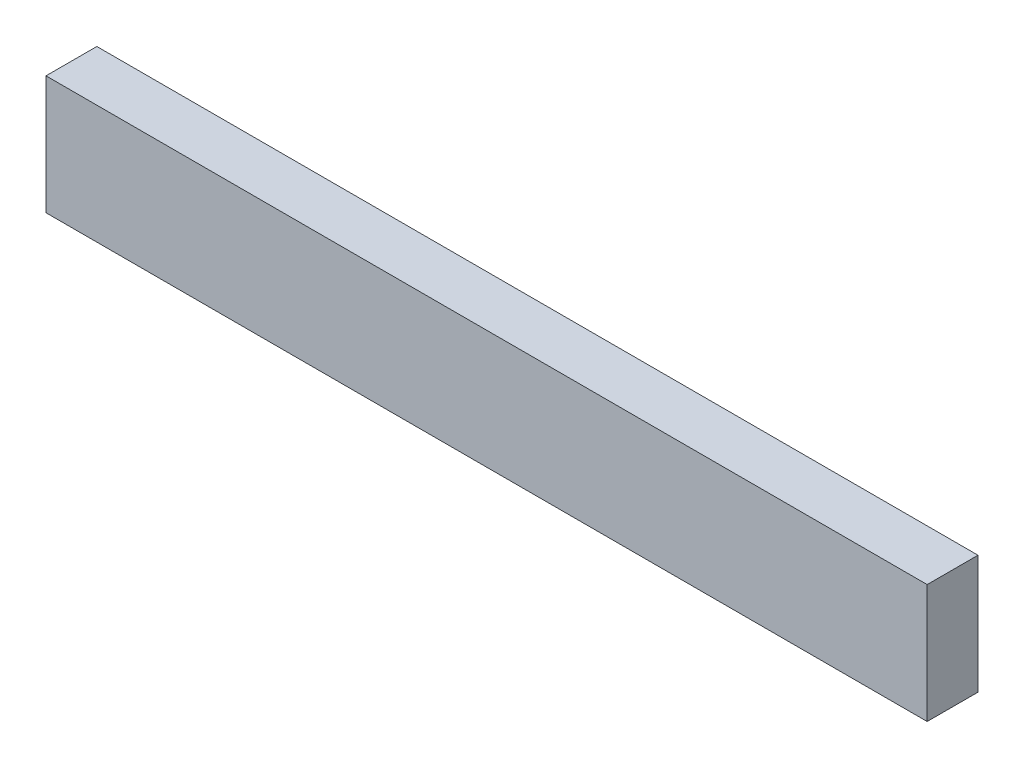
ISO-10303-21;
HEADER;
FILE_DESCRIPTION(('STEP AP214'),'2;1');
FILE_NAME('part.step','',(''),(''),'','','');
FILE_SCHEMA(('AUTOMOTIVE_DESIGN { 1 0 10303 214 1 1 1 1 }'));
ENDSEC;
DATA;
#1=APPLICATION_CONTEXT('core data for automotive mechanical design processes');
#2=APPLICATION_PROTOCOL_DEFINITION('international standard','automotive_design',2000,#1);
#3=PRODUCT_CONTEXT('',#1,'mechanical');
#4=PRODUCT('Part','Part','',(#3));
#5=PRODUCT_RELATED_PRODUCT_CATEGORY('part','',(#4));
#6=PRODUCT_DEFINITION_FORMATION('','',#4);
#7=PRODUCT_DEFINITION_CONTEXT('part definition',#1,'design');
#8=PRODUCT_DEFINITION('design','',#6,#7);
#9=PRODUCT_DEFINITION_SHAPE('','',#8);
#10=(LENGTH_UNIT() NAMED_UNIT(*) SI_UNIT(.MILLI.,.METRE.));
#11=(NAMED_UNIT(*) PLANE_ANGLE_UNIT() SI_UNIT($,.RADIAN.));
#12=(NAMED_UNIT(*) SI_UNIT($,.STERADIAN.) SOLID_ANGLE_UNIT());
#13=UNCERTAINTY_MEASURE_WITH_UNIT(LENGTH_MEASURE(1.E-05),#10,'distance_accuracy_value','');
#14=(GEOMETRIC_REPRESENTATION_CONTEXT(3) GLOBAL_UNCERTAINTY_ASSIGNED_CONTEXT((#13)) GLOBAL_UNIT_ASSIGNED_CONTEXT((#10,
#11,#12)) REPRESENTATION_CONTEXT('',''));
#15=CARTESIAN_POINT('',(0.,0.,0.));
#16=DIRECTION('',(0.,0.,1.));
#17=DIRECTION('',(1.,0.,0.));
#18=AXIS2_PLACEMENT_3D('',#15,#16,#17);
#19=CARTESIAN_POINT('',(660.4,-44.45,-19.05));
#20=DIRECTION('',(0.,0.,1.));
#21=DIRECTION('',(1.,0.,0.));
#22=AXIS2_PLACEMENT_3D('',#19,#20,#21);
#23=PLANE('',#22);
#24=DIRECTION('',(0.,1.,0.));
#25=VECTOR('',#24,1.);
#26=CARTESIAN_POINT('',(0.,-44.45,-19.05));
#27=LINE('',#26,#25);
#28=CARTESIAN_POINT('',(0.,-44.45,-19.05));
#29=VERTEX_POINT('',#28);
#30=CARTESIAN_POINT('',(0.,44.45,-19.05));
#31=VERTEX_POINT('',#30);
#32=EDGE_CURVE('E95',#29,#31,#27,.T.);
#33=ORIENTED_EDGE('',*,*,#32,.T.);
#34=DIRECTION('',(-1.,0.,0.));
#35=VECTOR('',#34,1.);
#36=CARTESIAN_POINT('',(660.4,44.45,-19.05));
#37=LINE('',#36,#35);
#38=CARTESIAN_POINT('',(660.4,44.45,-19.05));
#39=VERTEX_POINT('',#38);
#40=EDGE_CURVE('E11',#39,#31,#37,.T.);
#41=ORIENTED_EDGE('',*,*,#40,.F.);
#42=DIRECTION('',(0.,1.,0.));
#43=VECTOR('',#42,1.);
#44=CARTESIAN_POINT('',(660.4,-44.45,-19.05));
#45=LINE('',#44,#43);
#46=CARTESIAN_POINT('',(660.4,-44.45,-19.05));
#47=VERTEX_POINT('',#46);
#48=EDGE_CURVE('E83',#47,#39,#45,.T.);
#49=ORIENTED_EDGE('',*,*,#48,.F.);
#50=DIRECTION('',(-1.,0.,0.));
#51=VECTOR('',#50,1.);
#52=CARTESIAN_POINT('',(660.4,-44.45,-19.05));
#53=LINE('',#52,#51);
#54=EDGE_CURVE('E91',#47,#29,#53,.T.);
#55=ORIENTED_EDGE('',*,*,#54,.T.);
#56=EDGE_LOOP('',(#33,#41,#49,#55));
#57=FACE_BOUND('',#56,.T.);
#58=ADVANCED_FACE('F32',(#57),#23,.F.);
#59=CARTESIAN_POINT('',(660.4,44.45,19.05));
#60=DIRECTION('',(0.,-1.,0.));
#61=DIRECTION('',(0.,0.,-1.));
#62=AXIS2_PLACEMENT_3D('',#59,#60,#61);
#63=PLANE('',#62);
#64=DIRECTION('',(0.,0.,1.));
#65=VECTOR('',#64,1.);
#66=CARTESIAN_POINT('',(0.,44.45,19.05));
#67=LINE('',#66,#65);
#68=CARTESIAN_POINT('',(0.,44.45,19.05));
#69=VERTEX_POINT('',#68);
#70=EDGE_CURVE('E87',#31,#69,#67,.T.);
#71=ORIENTED_EDGE('',*,*,#70,.T.);
#72=DIRECTION('',(-1.,0.,0.));
#73=VECTOR('',#72,1.);
#74=CARTESIAN_POINT('',(660.4,44.45,19.05));
#75=LINE('',#74,#73);
#76=CARTESIAN_POINT('',(660.4,44.45,19.05));
#77=VERTEX_POINT('',#76);
#78=EDGE_CURVE('E40',#77,#69,#75,.T.);
#79=ORIENTED_EDGE('',*,*,#78,.F.);
#80=DIRECTION('',(0.,0.,1.));
#81=VECTOR('',#80,1.);
#82=CARTESIAN_POINT('',(660.4,44.45,19.05));
#83=LINE('',#82,#81);
#84=EDGE_CURVE('E78',#39,#77,#83,.T.);
#85=ORIENTED_EDGE('',*,*,#84,.F.);
#86=ORIENTED_EDGE('',*,*,#40,.T.);
#87=EDGE_LOOP('',(#71,#79,#85,#86));
#88=FACE_BOUND('',#87,.T.);
#89=ADVANCED_FACE('F86',(#88),#63,.F.);
#90=CARTESIAN_POINT('',(660.4,-44.45,19.05));
#91=DIRECTION('',(0.,0.,-1.));
#92=DIRECTION('',(-1.,0.,0.));
#93=AXIS2_PLACEMENT_3D('',#90,#91,#92);
#94=PLANE('',#93);
#95=DIRECTION('',(0.,-1.,0.));
#96=VECTOR('',#95,1.);
#97=CARTESIAN_POINT('',(0.,-44.45,19.05));
#98=LINE('',#97,#96);
#99=CARTESIAN_POINT('',(0.,-44.45,19.05));
#100=VERTEX_POINT('',#99);
#101=EDGE_CURVE('E65',#69,#100,#98,.T.);
#102=ORIENTED_EDGE('',*,*,#101,.T.);
#103=DIRECTION('',(-1.,0.,0.));
#104=VECTOR('',#103,1.);
#105=CARTESIAN_POINT('',(660.4,-44.45,19.05));
#106=LINE('',#105,#104);
#107=CARTESIAN_POINT('',(660.4,-44.45,19.05));
#108=VERTEX_POINT('',#107);
#109=EDGE_CURVE('E88',#108,#100,#106,.T.);
#110=ORIENTED_EDGE('',*,*,#109,.F.);
#111=DIRECTION('',(0.,-1.,0.));
#112=VECTOR('',#111,1.);
#113=CARTESIAN_POINT('',(660.4,-44.45,19.05));
#114=LINE('',#113,#112);
#115=EDGE_CURVE('E81',#77,#108,#114,.T.);
#116=ORIENTED_EDGE('',*,*,#115,.F.);
#117=ORIENTED_EDGE('',*,*,#78,.T.);
#118=EDGE_LOOP('',(#102,#110,#116,#117));
#119=FACE_BOUND('',#118,.T.);
#120=ADVANCED_FACE('F89',(#119),#94,.F.);
#121=CARTESIAN_POINT('',(660.4,-44.45,19.05));
#122=DIRECTION('',(0.,1.,0.));
#123=DIRECTION('',(0.,0.,1.));
#124=AXIS2_PLACEMENT_3D('',#121,#122,#123);
#125=PLANE('',#124);
#126=DIRECTION('',(0.,0.,-1.));
#127=VECTOR('',#126,1.);
#128=CARTESIAN_POINT('',(0.,-44.45,19.05));
#129=LINE('',#128,#127);
#130=EDGE_CURVE('E71',#100,#29,#129,.T.);
#131=ORIENTED_EDGE('',*,*,#130,.T.);
#132=ORIENTED_EDGE('',*,*,#54,.F.);
#133=DIRECTION('',(0.,0.,-1.));
#134=VECTOR('',#133,1.);
#135=CARTESIAN_POINT('',(660.4,-44.45,19.05));
#136=LINE('',#135,#134);
#137=EDGE_CURVE('E48',#108,#47,#136,.T.);
#138=ORIENTED_EDGE('',*,*,#137,.F.);
#139=ORIENTED_EDGE('',*,*,#109,.T.);
#140=EDGE_LOOP('',(#131,#132,#138,#139));
#141=FACE_BOUND('',#140,.T.);
#142=ADVANCED_FACE('F102',(#141),#125,.F.);
#143=CARTESIAN_POINT('',(660.4,0.,0.));
#144=DIRECTION('',(-1.,0.,0.));
#145=DIRECTION('',(0.,0.,1.));
#146=AXIS2_PLACEMENT_3D('',#143,#144,#145);
#147=PLANE('',#146);
#148=ORIENTED_EDGE('',*,*,#48,.T.);
#149=ORIENTED_EDGE('',*,*,#84,.T.);
#150=ORIENTED_EDGE('',*,*,#115,.T.);
#151=ORIENTED_EDGE('',*,*,#137,.T.);
#152=EDGE_LOOP('',(#148,#149,#150,#151));
#153=FACE_BOUND('',#152,.T.);
#154=ADVANCED_FACE('F79',(#153),#147,.F.);
#155=CARTESIAN_POINT('',(0.,0.,0.));
#156=DIRECTION('',(-1.,0.,0.));
#157=DIRECTION('',(0.,0.,1.));
#158=AXIS2_PLACEMENT_3D('',#155,#156,#157);
#159=PLANE('',#158);
#160=ORIENTED_EDGE('',*,*,#32,.F.);
#161=ORIENTED_EDGE('',*,*,#130,.F.);
#162=ORIENTED_EDGE('',*,*,#101,.F.);
#163=ORIENTED_EDGE('',*,*,#70,.F.);
#164=EDGE_LOOP('',(#160,#161,#162,#163));
#165=FACE_BOUND('',#164,.T.);
#166=ADVANCED_FACE('F105',(#165),#159,.T.);
#167=CLOSED_SHELL('',(#58,#89,#120,#142,#154,#166));
#168=MANIFOLD_SOLID_BREP('B2',#167);
#169=ADVANCED_BREP_SHAPE_REPRESENTATION('',(#18,#168),#14);
#170=SHAPE_DEFINITION_REPRESENTATION(#9,#169);
ENDSEC;
END-ISO-10303-21;
